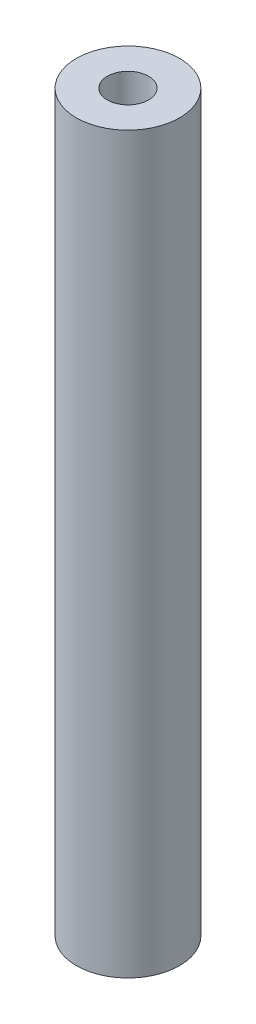
ISO-10303-21;
HEADER;
FILE_DESCRIPTION(('STEP AP214'),'2;1');
FILE_NAME('part.step','',(''),(''),'','','');
FILE_SCHEMA(('AUTOMOTIVE_DESIGN { 1 0 10303 214 1 1 1 1 }'));
ENDSEC;
DATA;
#1=APPLICATION_CONTEXT('core data for automotive mechanical design processes');
#2=APPLICATION_PROTOCOL_DEFINITION('international standard','automotive_design',2000,#1);
#3=PRODUCT_CONTEXT('',#1,'mechanical');
#4=PRODUCT('Part','Part','',(#3));
#5=PRODUCT_RELATED_PRODUCT_CATEGORY('part','',(#4));
#6=PRODUCT_DEFINITION_FORMATION('','',#4);
#7=PRODUCT_DEFINITION_CONTEXT('part definition',#1,'design');
#8=PRODUCT_DEFINITION('design','',#6,#7);
#9=PRODUCT_DEFINITION_SHAPE('','',#8);
#10=(LENGTH_UNIT() NAMED_UNIT(*) SI_UNIT(.MILLI.,.METRE.));
#11=(NAMED_UNIT(*) PLANE_ANGLE_UNIT() SI_UNIT($,.RADIAN.));
#12=(NAMED_UNIT(*) SI_UNIT($,.STERADIAN.) SOLID_ANGLE_UNIT());
#13=UNCERTAINTY_MEASURE_WITH_UNIT(LENGTH_MEASURE(1.E-05),#10,'distance_accuracy_value','');
#14=(GEOMETRIC_REPRESENTATION_CONTEXT(3) GLOBAL_UNCERTAINTY_ASSIGNED_CONTEXT((#13)) GLOBAL_UNIT_ASSIGNED_CONTEXT((#10,
#11,#12)) REPRESENTATION_CONTEXT('',''));
#15=CARTESIAN_POINT('',(0.,0.,0.));
#16=DIRECTION('',(0.,0.,1.));
#17=DIRECTION('',(1.,0.,0.));
#18=AXIS2_PLACEMENT_3D('',#15,#16,#17);
#19=CARTESIAN_POINT('',(0.,89.,0.));
#20=DIRECTION('',(0.,-1.,0.));
#21=DIRECTION('',(0.,0.,-1.));
#22=AXIS2_PLACEMENT_3D('',#19,#20,#21);
#23=CYLINDRICAL_SURFACE('',#22,6.25);
#24=CARTESIAN_POINT('',(0.,89.,0.));
#25=DIRECTION('',(0.,1.,0.));
#26=DIRECTION('',(0.,0.,1.));
#27=AXIS2_PLACEMENT_3D('',#24,#25,#26);
#28=CIRCLE('',#27,6.25);
#29=CARTESIAN_POINT('',(0.,89.,6.25));
#30=VERTEX_POINT('',#29);
#31=EDGE_CURVE('E10',#30,#30,#28,.T.);
#32=ORIENTED_EDGE('',*,*,#31,.F.);
#33=EDGE_LOOP('',(#32));
#34=FACE_BOUND('',#33,.T.);
#35=CARTESIAN_POINT('',(0.,0.,0.));
#36=DIRECTION('',(0.,1.,0.));
#37=DIRECTION('',(0.,0.,1.));
#38=AXIS2_PLACEMENT_3D('',#35,#36,#37);
#39=CIRCLE('',#38,6.25);
#40=CARTESIAN_POINT('',(0.,0.,6.25));
#41=VERTEX_POINT('',#40);
#42=EDGE_CURVE('E39',#41,#41,#39,.T.);
#43=ORIENTED_EDGE('',*,*,#42,.T.);
#44=EDGE_LOOP('',(#43));
#45=FACE_BOUND('',#44,.T.);
#46=ADVANCED_FACE('F36',(#34,#45),#23,.T.);
#47=CARTESIAN_POINT('',(0.,89.,0.));
#48=DIRECTION('',(0.,1.,0.));
#49=DIRECTION('',(0.,0.,1.));
#50=AXIS2_PLACEMENT_3D('',#47,#48,#49);
#51=PLANE('',#50);
#52=CARTESIAN_POINT('',(0.,89.,0.));
#53=DIRECTION('',(0.,1.,0.));
#54=DIRECTION('',(0.,0.,1.));
#55=AXIS2_PLACEMENT_3D('',#52,#53,#54);
#56=CIRCLE('',#55,2.5);
#57=CARTESIAN_POINT('',(0.,89.,2.5));
#58=VERTEX_POINT('',#57);
#59=EDGE_CURVE('E48',#58,#58,#56,.T.);
#60=ORIENTED_EDGE('',*,*,#59,.F.);
#61=EDGE_LOOP('',(#60));
#62=FACE_BOUND('',#61,.T.);
#63=ORIENTED_EDGE('',*,*,#31,.T.);
#64=EDGE_LOOP('',(#63));
#65=FACE_BOUND('',#64,.T.);
#66=ADVANCED_FACE('F73',(#62,#65),#51,.T.);
#67=CARTESIAN_POINT('',(0.,0.,0.));
#68=DIRECTION('',(0.,1.,0.));
#69=DIRECTION('',(0.,0.,1.));
#70=AXIS2_PLACEMENT_3D('',#67,#68,#69);
#71=PLANE('',#70);
#72=CARTESIAN_POINT('',(0.,0.,0.));
#73=DIRECTION('',(0.,-1.,0.));
#74=DIRECTION('',(0.,0.,-1.));
#75=AXIS2_PLACEMENT_3D('',#72,#73,#74);
#76=CIRCLE('',#75,2.5);
#77=CARTESIAN_POINT('',(0.,0.,-2.5));
#78=VERTEX_POINT('',#77);
#79=EDGE_CURVE('E54',#78,#78,#76,.T.);
#80=ORIENTED_EDGE('',*,*,#79,.F.);
#81=EDGE_LOOP('',(#80));
#82=FACE_BOUND('',#81,.T.);
#83=ORIENTED_EDGE('',*,*,#42,.F.);
#84=EDGE_LOOP('',(#83));
#85=FACE_BOUND('',#84,.T.);
#86=ADVANCED_FACE('F69',(#82,#85),#71,.F.);
#87=CARTESIAN_POINT('',(0.,79.,0.));
#88=DIRECTION('',(0.,1.,0.));
#89=DIRECTION('',(0.,0.,1.));
#90=AXIS2_PLACEMENT_3D('',#87,#88,#89);
#91=CYLINDRICAL_SURFACE('',#90,2.5);
#92=CARTESIAN_POINT('',(0.,79.,0.));
#93=DIRECTION('',(0.,1.,0.));
#94=DIRECTION('',(0.,0.,1.));
#95=AXIS2_PLACEMENT_3D('',#92,#93,#94);
#96=CIRCLE('',#95,2.5);
#97=CARTESIAN_POINT('',(0.,79.,2.5));
#98=VERTEX_POINT('',#97);
#99=EDGE_CURVE('E46',#98,#98,#96,.T.);
#100=ORIENTED_EDGE('',*,*,#99,.F.);
#101=EDGE_LOOP('',(#100));
#102=FACE_BOUND('',#101,.T.);
#103=ORIENTED_EDGE('',*,*,#59,.T.);
#104=EDGE_LOOP('',(#103));
#105=FACE_BOUND('',#104,.T.);
#106=ADVANCED_FACE('F72',(#102,#105),#91,.F.);
#107=CARTESIAN_POINT('',(0.,79.,0.));
#108=DIRECTION('',(0.,1.,0.));
#109=DIRECTION('',(0.,0.,1.));
#110=AXIS2_PLACEMENT_3D('',#107,#108,#109);
#111=PLANE('',#110);
#112=ORIENTED_EDGE('',*,*,#99,.T.);
#113=EDGE_LOOP('',(#112));
#114=FACE_BOUND('',#113,.T.);
#115=ADVANCED_FACE('F65',(#114),#111,.T.);
#116=CARTESIAN_POINT('',(0.,10.,0.));
#117=DIRECTION('',(0.,-1.,0.));
#118=DIRECTION('',(0.,0.,-1.));
#119=AXIS2_PLACEMENT_3D('',#116,#117,#118);
#120=CYLINDRICAL_SURFACE('',#119,2.5);
#121=CARTESIAN_POINT('',(0.,10.,0.));
#122=DIRECTION('',(0.,-1.,0.));
#123=DIRECTION('',(0.,0.,-1.));
#124=AXIS2_PLACEMENT_3D('',#121,#122,#123);
#125=CIRCLE('',#124,2.5);
#126=CARTESIAN_POINT('',(0.,10.,-2.5));
#127=VERTEX_POINT('',#126);
#128=EDGE_CURVE('E51',#127,#127,#125,.T.);
#129=ORIENTED_EDGE('',*,*,#128,.F.);
#130=EDGE_LOOP('',(#129));
#131=FACE_BOUND('',#130,.T.);
#132=ORIENTED_EDGE('',*,*,#79,.T.);
#133=EDGE_LOOP('',(#132));
#134=FACE_BOUND('',#133,.T.);
#135=ADVANCED_FACE('F62',(#131,#134),#120,.F.);
#136=CARTESIAN_POINT('',(0.,10.,0.));
#137=DIRECTION('',(0.,-1.,0.));
#138=DIRECTION('',(0.,0.,-1.));
#139=AXIS2_PLACEMENT_3D('',#136,#137,#138);
#140=PLANE('',#139);
#141=ORIENTED_EDGE('',*,*,#128,.T.);
#142=EDGE_LOOP('',(#141));
#143=FACE_BOUND('',#142,.T.);
#144=ADVANCED_FACE('F60',(#143),#140,.T.);
#145=CLOSED_SHELL('',(#46,#66,#86,#106,#115,#135,#144));
#146=MANIFOLD_SOLID_BREP('B2',#145);
#147=ADVANCED_BREP_SHAPE_REPRESENTATION('',(#18,#146),#14);
#148=SHAPE_DEFINITION_REPRESENTATION(#9,#147);
ENDSEC;
END-ISO-10303-21;
